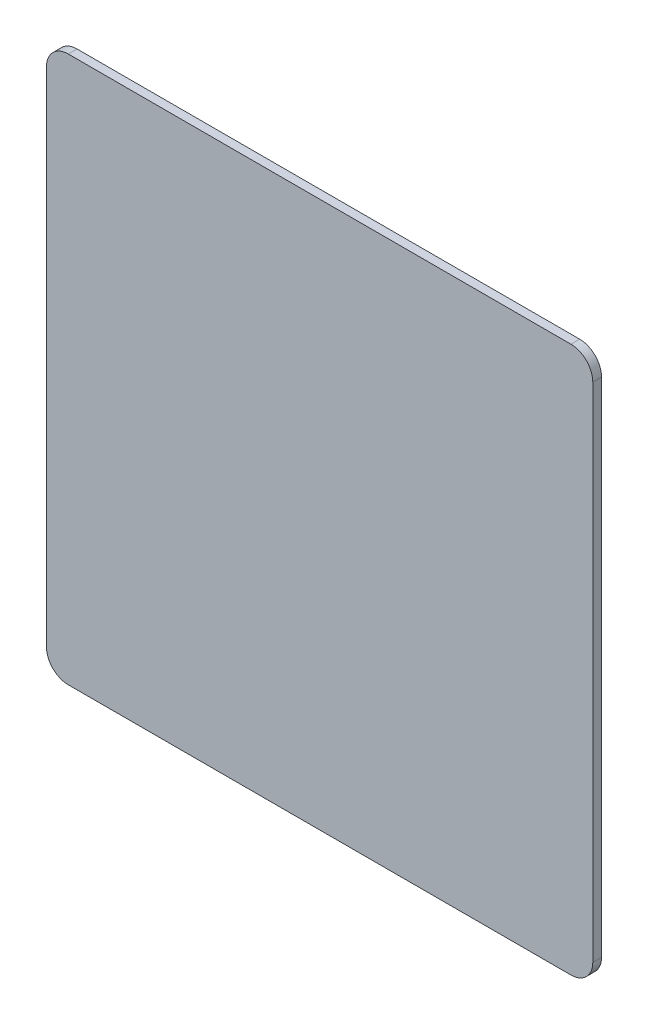
ISO-10303-21;
HEADER;
FILE_DESCRIPTION(('STEP AP214'),'2;1');
FILE_NAME('part.step','',(''),(''),'','','');
FILE_SCHEMA(('AUTOMOTIVE_DESIGN { 1 0 10303 214 1 1 1 1 }'));
ENDSEC;
DATA;
#1=APPLICATION_CONTEXT('core data for automotive mechanical design processes');
#2=APPLICATION_PROTOCOL_DEFINITION('international standard','automotive_design',2000,#1);
#3=PRODUCT_CONTEXT('',#1,'mechanical');
#4=PRODUCT('Part','Part','',(#3));
#5=PRODUCT_RELATED_PRODUCT_CATEGORY('part','',(#4));
#6=PRODUCT_DEFINITION_FORMATION('','',#4);
#7=PRODUCT_DEFINITION_CONTEXT('part definition',#1,'design');
#8=PRODUCT_DEFINITION('design','',#6,#7);
#9=PRODUCT_DEFINITION_SHAPE('','',#8);
#10=(LENGTH_UNIT() NAMED_UNIT(*) SI_UNIT(.MILLI.,.METRE.));
#11=(NAMED_UNIT(*) PLANE_ANGLE_UNIT() SI_UNIT($,.RADIAN.));
#12=(NAMED_UNIT(*) SI_UNIT($,.STERADIAN.) SOLID_ANGLE_UNIT());
#13=UNCERTAINTY_MEASURE_WITH_UNIT(LENGTH_MEASURE(1.E-05),#10,'distance_accuracy_value','');
#14=(GEOMETRIC_REPRESENTATION_CONTEXT(3) GLOBAL_UNCERTAINTY_ASSIGNED_CONTEXT((#13)) GLOBAL_UNIT_ASSIGNED_CONTEXT((#10,
#11,#12)) REPRESENTATION_CONTEXT('',''));
#15=CARTESIAN_POINT('',(0.,0.,0.));
#16=DIRECTION('',(0.,0.,1.));
#17=DIRECTION('',(1.,0.,0.));
#18=AXIS2_PLACEMENT_3D('',#15,#16,#17);
#19=CARTESIAN_POINT('',(0.,0.,4.));
#20=DIRECTION('',(1.,0.,0.));
#21=DIRECTION('',(0.,1.,0.));
#22=AXIS2_PLACEMENT_3D('',#19,#20,#21);
#23=PLANE('',#22);
#24=DIRECTION('',(0.,-1.,0.));
#25=VECTOR('',#24,1.);
#26=CARTESIAN_POINT('',(0.,0.,0.));
#27=LINE('',#26,#25);
#28=CARTESIAN_POINT('',(0.,-10.,0.));
#29=VERTEX_POINT('',#28);
#30=CARTESIAN_POINT('',(0.,-240.,0.));
#31=VERTEX_POINT('',#30);
#32=EDGE_CURVE('E130',#29,#31,#27,.T.);
#33=ORIENTED_EDGE('',*,*,#32,.T.);
#34=DIRECTION('',(0.,0.,-1.));
#35=VECTOR('',#34,1.);
#36=CARTESIAN_POINT('',(0.,-240.,4.));
#37=LINE('',#36,#35);
#38=CARTESIAN_POINT('',(0.,-240.,4.));
#39=VERTEX_POINT('',#38);
#40=EDGE_CURVE('E152',#31,#39,#37,.F.);
#41=ORIENTED_EDGE('',*,*,#40,.T.);
#42=DIRECTION('',(0.,-1.,0.));
#43=VECTOR('',#42,1.);
#44=CARTESIAN_POINT('',(0.,0.,4.));
#45=LINE('',#44,#43);
#46=CARTESIAN_POINT('',(0.,-10.,4.));
#47=VERTEX_POINT('',#46);
#48=EDGE_CURVE('E128',#47,#39,#45,.T.);
#49=ORIENTED_EDGE('',*,*,#48,.F.);
#50=DIRECTION('',(0.,0.,-1.));
#51=VECTOR('',#50,1.);
#52=CARTESIAN_POINT('',(0.,-10.,4.));
#53=LINE('',#52,#51);
#54=EDGE_CURVE('E149',#47,#29,#53,.T.);
#55=ORIENTED_EDGE('',*,*,#54,.T.);
#56=EDGE_LOOP('',(#33,#41,#49,#55));
#57=FACE_BOUND('',#56,.T.);
#58=ADVANCED_FACE('F33',(#57),#23,.F.);
#59=CARTESIAN_POINT('',(0.,-250.,4.));
#60=DIRECTION('',(0.,1.,0.));
#61=DIRECTION('',(0.,0.,1.));
#62=AXIS2_PLACEMENT_3D('',#59,#60,#61);
#63=PLANE('',#62);
#64=DIRECTION('',(1.,0.,0.));
#65=VECTOR('',#64,1.);
#66=CARTESIAN_POINT('',(0.,-250.,0.));
#67=LINE('',#66,#65);
#68=CARTESIAN_POINT('',(10.,-250.,0.));
#69=VERTEX_POINT('',#68);
#70=CARTESIAN_POINT('',(240.,-250.,0.));
#71=VERTEX_POINT('',#70);
#72=EDGE_CURVE('E126',#69,#71,#67,.T.);
#73=ORIENTED_EDGE('',*,*,#72,.T.);
#74=DIRECTION('',(0.,0.,-1.));
#75=VECTOR('',#74,1.);
#76=CARTESIAN_POINT('',(240.,-250.,4.));
#77=LINE('',#76,#75);
#78=CARTESIAN_POINT('',(240.,-250.,4.));
#79=VERTEX_POINT('',#78);
#80=EDGE_CURVE('E104',#71,#79,#77,.F.);
#81=ORIENTED_EDGE('',*,*,#80,.T.);
#82=DIRECTION('',(1.,0.,0.));
#83=VECTOR('',#82,1.);
#84=CARTESIAN_POINT('',(0.,-250.,4.));
#85=LINE('',#84,#83);
#86=CARTESIAN_POINT('',(10.,-250.,4.));
#87=VERTEX_POINT('',#86);
#88=EDGE_CURVE('E166',#87,#79,#85,.T.);
#89=ORIENTED_EDGE('',*,*,#88,.F.);
#90=DIRECTION('',(0.,0.,-1.));
#91=VECTOR('',#90,1.);
#92=CARTESIAN_POINT('',(10.,-250.,4.));
#93=LINE('',#92,#91);
#94=EDGE_CURVE('E109',#87,#69,#93,.T.);
#95=ORIENTED_EDGE('',*,*,#94,.T.);
#96=EDGE_LOOP('',(#73,#81,#89,#95));
#97=FACE_BOUND('',#96,.T.);
#98=ADVANCED_FACE('F171',(#97),#63,.F.);
#99=CARTESIAN_POINT('',(250.,0.,4.));
#100=DIRECTION('',(-1.,0.,0.));
#101=DIRECTION('',(0.,-1.,0.));
#102=AXIS2_PLACEMENT_3D('',#99,#100,#101);
#103=PLANE('',#102);
#104=DIRECTION('',(0.,1.,0.));
#105=VECTOR('',#104,1.);
#106=CARTESIAN_POINT('',(250.,0.,4.));
#107=LINE('',#106,#105);
#108=CARTESIAN_POINT('',(250.,-240.,4.));
#109=VERTEX_POINT('',#108);
#110=CARTESIAN_POINT('',(250.,-10.,4.));
#111=VERTEX_POINT('',#110);
#112=EDGE_CURVE('E118',#109,#111,#107,.T.);
#113=ORIENTED_EDGE('',*,*,#112,.F.);
#114=DIRECTION('',(0.,0.,-1.));
#115=VECTOR('',#114,1.);
#116=CARTESIAN_POINT('',(250.,-240.,4.));
#117=LINE('',#116,#115);
#118=CARTESIAN_POINT('',(250.,-240.,0.));
#119=VERTEX_POINT('',#118);
#120=EDGE_CURVE('E103',#109,#119,#117,.T.);
#121=ORIENTED_EDGE('',*,*,#120,.T.);
#122=DIRECTION('',(0.,1.,0.));
#123=VECTOR('',#122,1.);
#124=CARTESIAN_POINT('',(250.,0.,0.));
#125=LINE('',#124,#123);
#126=CARTESIAN_POINT('',(250.,-10.,0.));
#127=VERTEX_POINT('',#126);
#128=EDGE_CURVE('E116',#119,#127,#125,.T.);
#129=ORIENTED_EDGE('',*,*,#128,.T.);
#130=DIRECTION('',(0.,0.,-1.));
#131=VECTOR('',#130,1.);
#132=CARTESIAN_POINT('',(250.,-10.,4.));
#133=LINE('',#132,#131);
#134=EDGE_CURVE('E120',#127,#111,#133,.F.);
#135=ORIENTED_EDGE('',*,*,#134,.T.);
#136=EDGE_LOOP('',(#113,#121,#129,#135));
#137=FACE_BOUND('',#136,.T.);
#138=ADVANCED_FACE('F115',(#137),#103,.F.);
#139=CARTESIAN_POINT('',(0.,0.,4.));
#140=DIRECTION('',(0.,-1.,0.));
#141=DIRECTION('',(0.,0.,-1.));
#142=AXIS2_PLACEMENT_3D('',#139,#140,#141);
#143=PLANE('',#142);
#144=DIRECTION('',(-1.,0.,0.));
#145=VECTOR('',#144,1.);
#146=CARTESIAN_POINT('',(0.,0.,4.));
#147=LINE('',#146,#145);
#148=CARTESIAN_POINT('',(240.,0.,4.));
#149=VERTEX_POINT('',#148);
#150=CARTESIAN_POINT('',(10.,0.,4.));
#151=VERTEX_POINT('',#150);
#152=EDGE_CURVE('E134',#149,#151,#147,.T.);
#153=ORIENTED_EDGE('',*,*,#152,.F.);
#154=DIRECTION('',(0.,0.,-1.));
#155=VECTOR('',#154,1.);
#156=CARTESIAN_POINT('',(240.,0.,4.));
#157=LINE('',#156,#155);
#158=CARTESIAN_POINT('',(240.,0.,0.));
#159=VERTEX_POINT('',#158);
#160=EDGE_CURVE('E11',#149,#159,#157,.T.);
#161=ORIENTED_EDGE('',*,*,#160,.T.);
#162=DIRECTION('',(-1.,0.,0.));
#163=VECTOR('',#162,1.);
#164=CARTESIAN_POINT('',(0.,0.,0.));
#165=LINE('',#164,#163);
#166=CARTESIAN_POINT('',(10.,0.,0.));
#167=VERTEX_POINT('',#166);
#168=EDGE_CURVE('E125',#159,#167,#165,.T.);
#169=ORIENTED_EDGE('',*,*,#168,.T.);
#170=DIRECTION('',(0.,0.,-1.));
#171=VECTOR('',#170,1.);
#172=CARTESIAN_POINT('',(10.,0.,4.));
#173=LINE('',#172,#171);
#174=EDGE_CURVE('E41',#167,#151,#173,.F.);
#175=ORIENTED_EDGE('',*,*,#174,.T.);
#176=EDGE_LOOP('',(#153,#161,#169,#175));
#177=FACE_BOUND('',#176,.T.);
#178=ADVANCED_FACE('F178',(#177),#143,.F.);
#179=CARTESIAN_POINT('',(0.,0.,4.));
#180=DIRECTION('',(0.,0.,1.));
#181=DIRECTION('',(1.,0.,0.));
#182=AXIS2_PLACEMENT_3D('',#179,#180,#181);
#183=PLANE('',#182);
#184=ORIENTED_EDGE('',*,*,#88,.T.);
#185=CARTESIAN_POINT('',(240.,-240.,4.));
#186=DIRECTION('',(0.,0.,1.));
#187=DIRECTION('',(1.,0.,0.));
#188=AXIS2_PLACEMENT_3D('',#185,#186,#187);
#189=CIRCLE('',#188,10.);
#190=EDGE_CURVE('E147',#79,#109,#189,.T.);
#191=ORIENTED_EDGE('',*,*,#190,.T.);
#192=ORIENTED_EDGE('',*,*,#112,.T.);
#193=CARTESIAN_POINT('',(240.,-10.,4.));
#194=DIRECTION('',(0.,0.,1.));
#195=DIRECTION('',(1.,0.,0.));
#196=AXIS2_PLACEMENT_3D('',#193,#194,#195);
#197=CIRCLE('',#196,10.);
#198=EDGE_CURVE('E54',#111,#149,#197,.T.);
#199=ORIENTED_EDGE('',*,*,#198,.T.);
#200=ORIENTED_EDGE('',*,*,#152,.T.);
#201=CARTESIAN_POINT('',(10.,-10.,4.));
#202=DIRECTION('',(0.,0.,1.));
#203=DIRECTION('',(1.,0.,0.));
#204=AXIS2_PLACEMENT_3D('',#201,#202,#203);
#205=CIRCLE('',#204,10.);
#206=EDGE_CURVE('E142',#151,#47,#205,.T.);
#207=ORIENTED_EDGE('',*,*,#206,.T.);
#208=ORIENTED_EDGE('',*,*,#48,.T.);
#209=CARTESIAN_POINT('',(10.,-240.,4.));
#210=DIRECTION('',(0.,0.,1.));
#211=DIRECTION('',(1.,0.,0.));
#212=AXIS2_PLACEMENT_3D('',#209,#210,#211);
#213=CIRCLE('',#212,10.);
#214=EDGE_CURVE('E145',#39,#87,#213,.T.);
#215=ORIENTED_EDGE('',*,*,#214,.T.);
#216=EDGE_LOOP('',(#184,#191,#192,#199,#200,#207,#208,#215));
#217=FACE_BOUND('',#216,.T.);
#218=ADVANCED_FACE('F163',(#217),#183,.T.);
#219=CARTESIAN_POINT('',(0.,0.,0.));
#220=DIRECTION('',(0.,0.,1.));
#221=DIRECTION('',(1.,0.,0.));
#222=AXIS2_PLACEMENT_3D('',#219,#220,#221);
#223=PLANE('',#222);
#224=ORIENTED_EDGE('',*,*,#128,.F.);
#225=CARTESIAN_POINT('',(240.,-240.,0.));
#226=DIRECTION('',(0.,0.,1.));
#227=DIRECTION('',(1.,0.,0.));
#228=AXIS2_PLACEMENT_3D('',#225,#226,#227);
#229=CIRCLE('',#228,10.);
#230=EDGE_CURVE('E99',#119,#71,#229,.F.);
#231=ORIENTED_EDGE('',*,*,#230,.T.);
#232=ORIENTED_EDGE('',*,*,#72,.F.);
#233=CARTESIAN_POINT('',(10.,-240.,0.));
#234=DIRECTION('',(0.,0.,1.));
#235=DIRECTION('',(1.,0.,0.));
#236=AXIS2_PLACEMENT_3D('',#233,#234,#235);
#237=CIRCLE('',#236,10.);
#238=EDGE_CURVE('E110',#69,#31,#237,.F.);
#239=ORIENTED_EDGE('',*,*,#238,.T.);
#240=ORIENTED_EDGE('',*,*,#32,.F.);
#241=CARTESIAN_POINT('',(10.,-10.,0.));
#242=DIRECTION('',(0.,0.,1.));
#243=DIRECTION('',(1.,0.,0.));
#244=AXIS2_PLACEMENT_3D('',#241,#242,#243);
#245=CIRCLE('',#244,10.);
#246=EDGE_CURVE('E119',#29,#167,#245,.F.);
#247=ORIENTED_EDGE('',*,*,#246,.T.);
#248=ORIENTED_EDGE('',*,*,#168,.F.);
#249=CARTESIAN_POINT('',(240.,-10.,0.));
#250=DIRECTION('',(0.,0.,1.));
#251=DIRECTION('',(1.,0.,0.));
#252=AXIS2_PLACEMENT_3D('',#249,#250,#251);
#253=CIRCLE('',#252,10.);
#254=EDGE_CURVE('E124',#159,#127,#253,.F.);
#255=ORIENTED_EDGE('',*,*,#254,.T.);
#256=EDGE_LOOP('',(#224,#231,#232,#239,#240,#247,#248,#255));
#257=FACE_BOUND('',#256,.T.);
#258=ADVANCED_FACE('F122',(#257),#223,.F.);
#259=CARTESIAN_POINT('',(240.,-240.,4.));
#260=DIRECTION('',(0.,0.,-1.));
#261=DIRECTION('',(-1.,0.,0.));
#262=AXIS2_PLACEMENT_3D('',#259,#260,#261);
#263=CYLINDRICAL_SURFACE('',#262,10.);
#264=ORIENTED_EDGE('',*,*,#190,.F.);
#265=ORIENTED_EDGE('',*,*,#80,.F.);
#266=ORIENTED_EDGE('',*,*,#230,.F.);
#267=ORIENTED_EDGE('',*,*,#120,.F.);
#268=EDGE_LOOP('',(#264,#265,#266,#267));
#269=FACE_BOUND('',#268,.T.);
#270=ADVANCED_FACE('F102',(#269),#263,.T.);
#271=CARTESIAN_POINT('',(10.,-240.,4.));
#272=DIRECTION('',(0.,0.,-1.));
#273=DIRECTION('',(-1.,0.,0.));
#274=AXIS2_PLACEMENT_3D('',#271,#272,#273);
#275=CYLINDRICAL_SURFACE('',#274,10.);
#276=ORIENTED_EDGE('',*,*,#214,.F.);
#277=ORIENTED_EDGE('',*,*,#40,.F.);
#278=ORIENTED_EDGE('',*,*,#238,.F.);
#279=ORIENTED_EDGE('',*,*,#94,.F.);
#280=EDGE_LOOP('',(#276,#277,#278,#279));
#281=FACE_BOUND('',#280,.T.);
#282=ADVANCED_FACE('F169',(#281),#275,.T.);
#283=CARTESIAN_POINT('',(240.,-10.,4.));
#284=DIRECTION('',(0.,0.,-1.));
#285=DIRECTION('',(-1.,0.,0.));
#286=AXIS2_PLACEMENT_3D('',#283,#284,#285);
#287=CYLINDRICAL_SURFACE('',#286,10.);
#288=ORIENTED_EDGE('',*,*,#198,.F.);
#289=ORIENTED_EDGE('',*,*,#134,.F.);
#290=ORIENTED_EDGE('',*,*,#254,.F.);
#291=ORIENTED_EDGE('',*,*,#160,.F.);
#292=EDGE_LOOP('',(#288,#289,#290,#291));
#293=FACE_BOUND('',#292,.T.);
#294=ADVANCED_FACE('F177',(#293),#287,.T.);
#295=CARTESIAN_POINT('',(10.,-10.,4.));
#296=DIRECTION('',(0.,0.,-1.));
#297=DIRECTION('',(-1.,0.,0.));
#298=AXIS2_PLACEMENT_3D('',#295,#296,#297);
#299=CYLINDRICAL_SURFACE('',#298,10.);
#300=ORIENTED_EDGE('',*,*,#206,.F.);
#301=ORIENTED_EDGE('',*,*,#174,.F.);
#302=ORIENTED_EDGE('',*,*,#246,.F.);
#303=ORIENTED_EDGE('',*,*,#54,.F.);
#304=EDGE_LOOP('',(#300,#301,#302,#303));
#305=FACE_BOUND('',#304,.T.);
#306=ADVANCED_FACE('F35',(#305),#299,.T.);
#307=CLOSED_SHELL('',(#58,#98,#138,#178,#218,#258,#270,#282,#294,#306));
#308=MANIFOLD_SOLID_BREP('B2',#307);
#309=ADVANCED_BREP_SHAPE_REPRESENTATION('',(#18,#308),#14);
#310=SHAPE_DEFINITION_REPRESENTATION(#9,#309);
ENDSEC;
END-ISO-10303-21;
